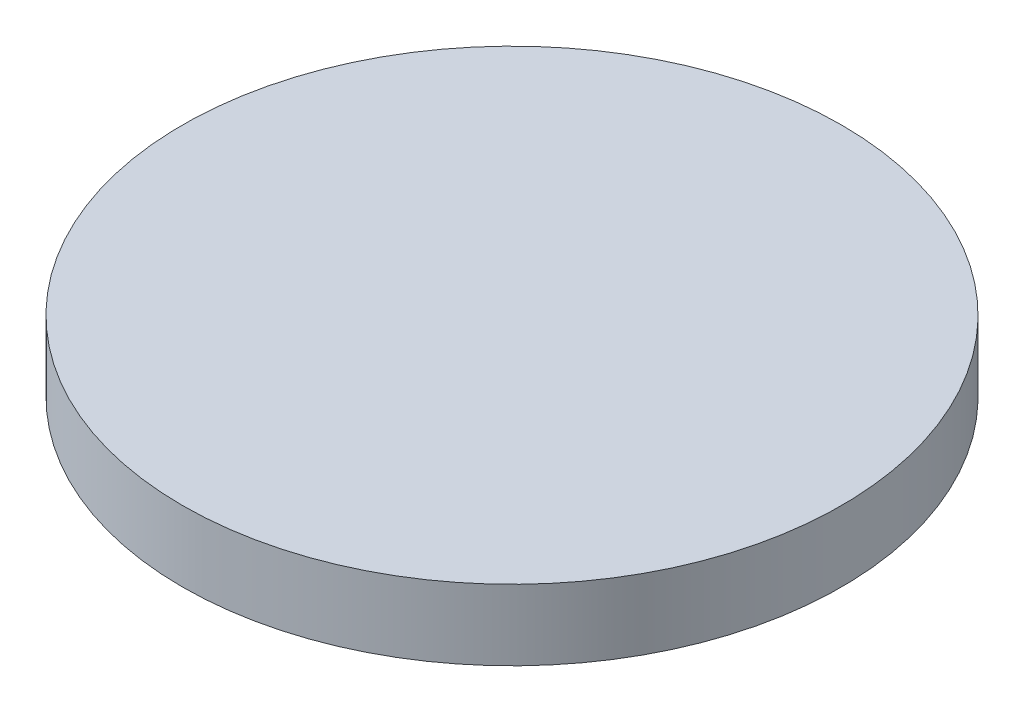
ISO-10303-21;
HEADER;
FILE_DESCRIPTION(('STEP AP214'),'2;1');
FILE_NAME('part.step','',(''),(''),'','','');
FILE_SCHEMA(('AUTOMOTIVE_DESIGN { 1 0 10303 214 1 1 1 1 }'));
ENDSEC;
DATA;
#1=APPLICATION_CONTEXT('core data for automotive mechanical design processes');
#2=APPLICATION_PROTOCOL_DEFINITION('international standard','automotive_design',2000,#1);
#3=PRODUCT_CONTEXT('',#1,'mechanical');
#4=PRODUCT('Part','Part','',(#3));
#5=PRODUCT_RELATED_PRODUCT_CATEGORY('part','',(#4));
#6=PRODUCT_DEFINITION_FORMATION('','',#4);
#7=PRODUCT_DEFINITION_CONTEXT('part definition',#1,'design');
#8=PRODUCT_DEFINITION('design','',#6,#7);
#9=PRODUCT_DEFINITION_SHAPE('','',#8);
#10=(LENGTH_UNIT() NAMED_UNIT(*) SI_UNIT(.MILLI.,.METRE.));
#11=(NAMED_UNIT(*) PLANE_ANGLE_UNIT() SI_UNIT($,.RADIAN.));
#12=(NAMED_UNIT(*) SI_UNIT($,.STERADIAN.) SOLID_ANGLE_UNIT());
#13=UNCERTAINTY_MEASURE_WITH_UNIT(LENGTH_MEASURE(1.E-05),#10,'distance_accuracy_value','');
#14=(GEOMETRIC_REPRESENTATION_CONTEXT(3) GLOBAL_UNCERTAINTY_ASSIGNED_CONTEXT((#13)) GLOBAL_UNIT_ASSIGNED_CONTEXT((#10,
#11,#12)) REPRESENTATION_CONTEXT('',''));
#15=CARTESIAN_POINT('',(0.,0.,0.));
#16=DIRECTION('',(0.,0.,1.));
#17=DIRECTION('',(1.,0.,0.));
#18=AXIS2_PLACEMENT_3D('',#15,#16,#17);
#19=CARTESIAN_POINT('',(0.,3.,0.));
#20=DIRECTION('',(0.,-1.,0.));
#21=DIRECTION('',(0.,0.,-1.));
#22=AXIS2_PLACEMENT_3D('',#19,#20,#21);
#23=CYLINDRICAL_SURFACE('',#22,14.);
#24=CARTESIAN_POINT('',(0.,3.,0.));
#25=DIRECTION('',(0.,1.,0.));
#26=DIRECTION('',(0.,0.,1.));
#27=AXIS2_PLACEMENT_3D('',#24,#25,#26);
#28=CIRCLE('',#27,14.);
#29=CARTESIAN_POINT('',(0.,3.,14.));
#30=VERTEX_POINT('',#29);
#31=EDGE_CURVE('E10',#30,#30,#28,.T.);
#32=ORIENTED_EDGE('',*,*,#31,.F.);
#33=EDGE_LOOP('',(#32));
#34=FACE_BOUND('',#33,.T.);
#35=CARTESIAN_POINT('',(0.,0.,0.));
#36=DIRECTION('',(0.,1.,0.));
#37=DIRECTION('',(0.,0.,1.));
#38=AXIS2_PLACEMENT_3D('',#35,#36,#37);
#39=CIRCLE('',#38,14.);
#40=CARTESIAN_POINT('',(0.,0.,14.));
#41=VERTEX_POINT('',#40);
#42=EDGE_CURVE('E34',#41,#41,#39,.T.);
#43=ORIENTED_EDGE('',*,*,#42,.T.);
#44=EDGE_LOOP('',(#43));
#45=FACE_BOUND('',#44,.T.);
#46=ADVANCED_FACE('F31',(#34,#45),#23,.T.);
#47=CARTESIAN_POINT('',(0.,3.,0.));
#48=DIRECTION('',(0.,1.,0.));
#49=DIRECTION('',(0.,0.,1.));
#50=AXIS2_PLACEMENT_3D('',#47,#48,#49);
#51=PLANE('',#50);
#52=ORIENTED_EDGE('',*,*,#31,.T.);
#53=EDGE_LOOP('',(#52));
#54=FACE_BOUND('',#53,.T.);
#55=ADVANCED_FACE('F46',(#54),#51,.T.);
#56=CARTESIAN_POINT('',(0.,0.,0.));
#57=DIRECTION('',(0.,1.,0.));
#58=DIRECTION('',(0.,0.,1.));
#59=AXIS2_PLACEMENT_3D('',#56,#57,#58);
#60=PLANE('',#59);
#61=ORIENTED_EDGE('',*,*,#42,.F.);
#62=EDGE_LOOP('',(#61));
#63=FACE_BOUND('',#62,.T.);
#64=ADVANCED_FACE('F44',(#63),#60,.F.);
#65=CLOSED_SHELL('',(#46,#55,#64));
#66=MANIFOLD_SOLID_BREP('B2',#65);
#67=ADVANCED_BREP_SHAPE_REPRESENTATION('',(#18,#66),#14);
#68=SHAPE_DEFINITION_REPRESENTATION(#9,#67);
ENDSEC;
END-ISO-10303-21;
